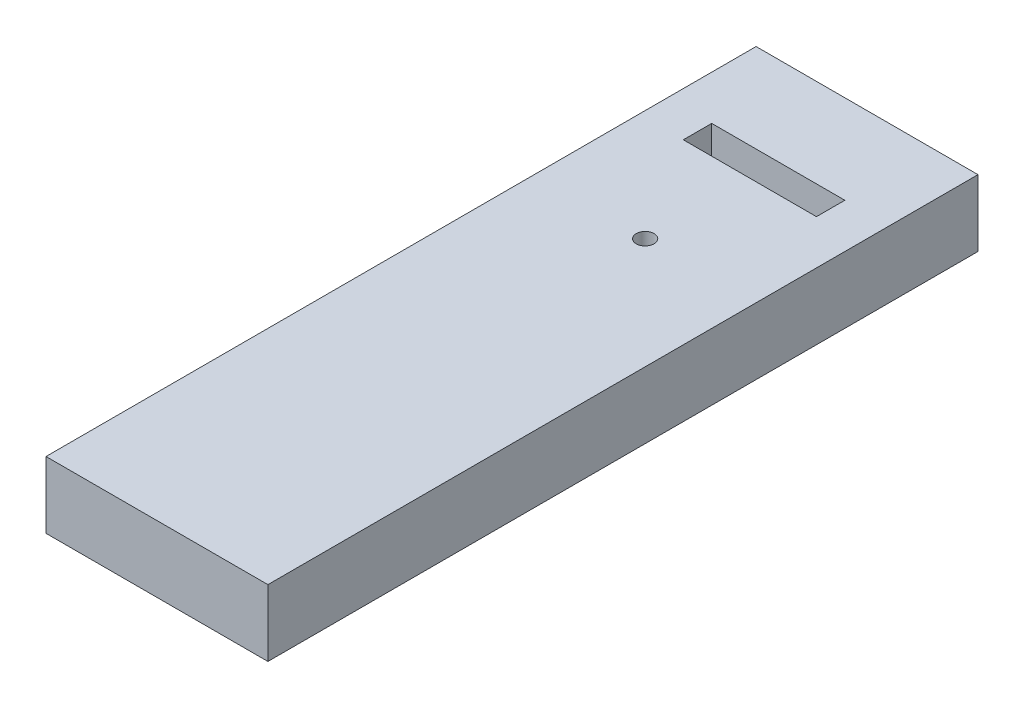
ISO-10303-21;
HEADER;
FILE_DESCRIPTION(('STEP AP214'),'2;1');
FILE_NAME('part.step','',(''),(''),'','','');
FILE_SCHEMA(('AUTOMOTIVE_DESIGN { 1 0 10303 214 1 1 1 1 }'));
ENDSEC;
DATA;
#1=APPLICATION_CONTEXT('core data for automotive mechanical design processes');
#2=APPLICATION_PROTOCOL_DEFINITION('international standard','automotive_design',2000,#1);
#3=PRODUCT_CONTEXT('',#1,'mechanical');
#4=PRODUCT('Part','Part','',(#3));
#5=PRODUCT_RELATED_PRODUCT_CATEGORY('part','',(#4));
#6=PRODUCT_DEFINITION_FORMATION('','',#4);
#7=PRODUCT_DEFINITION_CONTEXT('part definition',#1,'design');
#8=PRODUCT_DEFINITION('design','',#6,#7);
#9=PRODUCT_DEFINITION_SHAPE('','',#8);
#10=(LENGTH_UNIT() NAMED_UNIT(*) SI_UNIT(.MILLI.,.METRE.));
#11=(NAMED_UNIT(*) PLANE_ANGLE_UNIT() SI_UNIT($,.RADIAN.));
#12=(NAMED_UNIT(*) SI_UNIT($,.STERADIAN.) SOLID_ANGLE_UNIT());
#13=UNCERTAINTY_MEASURE_WITH_UNIT(LENGTH_MEASURE(1.E-05),#10,'distance_accuracy_value','');
#14=(GEOMETRIC_REPRESENTATION_CONTEXT(3) GLOBAL_UNCERTAINTY_ASSIGNED_CONTEXT((#13)) GLOBAL_UNIT_ASSIGNED_CONTEXT((#10,
#11,#12)) REPRESENTATION_CONTEXT('',''));
#15=CARTESIAN_POINT('',(0.,0.,0.));
#16=DIRECTION('',(0.,0.,1.));
#17=DIRECTION('',(1.,0.,0.));
#18=AXIS2_PLACEMENT_3D('',#15,#16,#17);
#19=CARTESIAN_POINT('',(0.,0.,0.));
#20=DIRECTION('',(0.,-1.,0.));
#21=DIRECTION('',(0.,0.,-1.));
#22=AXIS2_PLACEMENT_3D('',#19,#20,#21);
#23=PLANE('',#22);
#24=CARTESIAN_POINT('',(-23.8125,0.,-73.025));
#25=DIRECTION('',(0.,-1.,0.));
#26=DIRECTION('',(0.,0.,-1.));
#27=AXIS2_PLACEMENT_3D('',#24,#25,#26);
#28=CIRCLE('',#27,3.175);
#29=CARTESIAN_POINT('',(-26.9875,0.,-73.025));
#30=VERTEX_POINT('',#29);
#31=CARTESIAN_POINT('',(-23.8125,0.,-76.2));
#32=VERTEX_POINT('',#31);
#33=EDGE_CURVE('E339',#30,#32,#28,.T.);
#34=ORIENTED_EDGE('',*,*,#33,.F.);
#35=DIRECTION('',(0.,0.,-1.));
#36=VECTOR('',#35,1.);
#37=CARTESIAN_POINT('',(-26.9875,0.,90.4875));
#38=LINE('',#37,#36);
#39=CARTESIAN_POINT('',(-26.9875,0.,90.4875));
#40=VERTEX_POINT('',#39);
#41=EDGE_CURVE('E394',#40,#30,#38,.T.);
#42=ORIENTED_EDGE('',*,*,#41,.F.);
#43=CARTESIAN_POINT('',(-20.6375,0.,90.4875));
#44=DIRECTION('',(0.,-1.,0.));
#45=DIRECTION('',(0.,0.,-1.));
#46=AXIS2_PLACEMENT_3D('',#43,#44,#45);
#47=CIRCLE('',#46,6.35);
#48=CARTESIAN_POINT('',(-20.6375,0.,96.8375));
#49=VERTEX_POINT('',#48);
#50=EDGE_CURVE('E391',#49,#40,#47,.T.);
#51=ORIENTED_EDGE('',*,*,#50,.F.);
#52=DIRECTION('',(-1.,0.,0.));
#53=VECTOR('',#52,1.);
#54=CARTESIAN_POINT('',(20.6375,0.,96.8375));
#55=LINE('',#54,#53);
#56=CARTESIAN_POINT('',(20.6375,0.,96.8375));
#57=VERTEX_POINT('',#56);
#58=EDGE_CURVE('E388',#57,#49,#55,.T.);
#59=ORIENTED_EDGE('',*,*,#58,.F.);
#60=CARTESIAN_POINT('',(20.6375,0.,90.4875));
#61=DIRECTION('',(0.,-1.,0.));
#62=DIRECTION('',(0.,0.,-1.));
#63=AXIS2_PLACEMENT_3D('',#60,#61,#62);
#64=CIRCLE('',#63,6.35);
#65=CARTESIAN_POINT('',(26.9875,0.,90.4875));
#66=VERTEX_POINT('',#65);
#67=EDGE_CURVE('E350',#66,#57,#64,.T.);
#68=ORIENTED_EDGE('',*,*,#67,.F.);
#69=DIRECTION('',(0.,0.,1.));
#70=VECTOR('',#69,1.);
#71=CARTESIAN_POINT('',(26.9875,0.,90.4875));
#72=LINE('',#71,#70);
#73=CARTESIAN_POINT('',(26.9875,0.,-73.025));
#74=VERTEX_POINT('',#73);
#75=EDGE_CURVE('E370',#74,#66,#72,.T.);
#76=ORIENTED_EDGE('',*,*,#75,.F.);
#77=CARTESIAN_POINT('',(23.8125,0.,-73.025));
#78=DIRECTION('',(0.,-1.,0.));
#79=DIRECTION('',(0.,0.,-1.));
#80=AXIS2_PLACEMENT_3D('',#77,#78,#79);
#81=CIRCLE('',#80,3.175);
#82=CARTESIAN_POINT('',(23.8125,0.,-76.2));
#83=VERTEX_POINT('',#82);
#84=EDGE_CURVE('E320',#83,#74,#81,.T.);
#85=ORIENTED_EDGE('',*,*,#84,.F.);
#86=DIRECTION('',(1.,0.,0.));
#87=VECTOR('',#86,1.);
#88=CARTESIAN_POINT('',(23.8125,0.,-76.2));
#89=LINE('',#88,#87);
#90=CARTESIAN_POINT('',(4.76250000000001,0.,-76.2));
#91=VERTEX_POINT('',#90);
#92=EDGE_CURVE('E342',#91,#83,#89,.T.);
#93=ORIENTED_EDGE('',*,*,#92,.F.);
#94=DIRECTION('',(0.,0.,-1.));
#95=VECTOR('',#94,1.);
#96=CARTESIAN_POINT('',(4.76250000000001,0.,-76.2));
#97=LINE('',#96,#95);
#98=CARTESIAN_POINT('',(4.76250000000001,0.,-101.6));
#99=VERTEX_POINT('',#98);
#100=EDGE_CURVE('E284',#99,#91,#97,.F.);
#101=ORIENTED_EDGE('',*,*,#100,.F.);
#102=DIRECTION('',(-1.,0.,0.));
#103=VECTOR('',#102,1.);
#104=CARTESIAN_POINT('',(-31.75,0.,-101.6));
#105=LINE('',#104,#103);
#106=CARTESIAN_POINT('',(31.75,0.,-101.6));
#107=VERTEX_POINT('',#106);
#108=EDGE_CURVE('E267',#107,#99,#105,.T.);
#109=ORIENTED_EDGE('',*,*,#108,.F.);
#110=DIRECTION('',(0.,0.,-1.));
#111=VECTOR('',#110,1.);
#112=CARTESIAN_POINT('',(31.75,0.,101.6));
#113=LINE('',#112,#111);
#114=CARTESIAN_POINT('',(31.75,0.,101.6));
#115=VERTEX_POINT('',#114);
#116=EDGE_CURVE('E249',#115,#107,#113,.T.);
#117=ORIENTED_EDGE('',*,*,#116,.F.);
#118=DIRECTION('',(1.,0.,0.));
#119=VECTOR('',#118,1.);
#120=CARTESIAN_POINT('',(-31.75,0.,101.6));
#121=LINE('',#120,#119);
#122=CARTESIAN_POINT('',(-31.75,0.,101.6));
#123=VERTEX_POINT('',#122);
#124=EDGE_CURVE('E257',#123,#115,#121,.T.);
#125=ORIENTED_EDGE('',*,*,#124,.F.);
#126=DIRECTION('',(0.,0.,1.));
#127=VECTOR('',#126,1.);
#128=CARTESIAN_POINT('',(-31.75,0.,101.6));
#129=LINE('',#128,#127);
#130=CARTESIAN_POINT('',(-31.75,0.,-101.6));
#131=VERTEX_POINT('',#130);
#132=EDGE_CURVE('E270',#131,#123,#129,.T.);
#133=ORIENTED_EDGE('',*,*,#132,.F.);
#134=CARTESIAN_POINT('',(-4.76249999999999,0.,-101.6));
#135=VERTEX_POINT('',#134);
#136=EDGE_CURVE('E266',#135,#131,#105,.T.);
#137=ORIENTED_EDGE('',*,*,#136,.F.);
#138=DIRECTION('',(0.,0.,-1.));
#139=VECTOR('',#138,1.);
#140=CARTESIAN_POINT('',(-4.76249999999999,0.,-76.2));
#141=LINE('',#140,#139);
#142=CARTESIAN_POINT('',(-4.76249999999999,0.,-76.2));
#143=VERTEX_POINT('',#142);
#144=EDGE_CURVE('E287',#143,#135,#141,.T.);
#145=ORIENTED_EDGE('',*,*,#144,.F.);
#146=EDGE_CURVE('E343',#32,#143,#89,.T.);
#147=ORIENTED_EDGE('',*,*,#146,.F.);
#148=EDGE_LOOP('',(#34,#42,#51,#59,#68,#76,#85,#93,#101,#109,#117,#125,#133,#137,#145,#147));
#149=FACE_BOUND('',#148,.T.);
#150=ADVANCED_FACE('F35',(#149),#23,.T.);
#151=CARTESIAN_POINT('',(0.,19.05,0.));
#152=DIRECTION('',(0.,-1.,0.));
#153=DIRECTION('',(0.,0.,-1.));
#154=AXIS2_PLACEMENT_3D('',#151,#152,#153);
#155=PLANE('',#154);
#156=CARTESIAN_POINT('',(0.,19.05,-38.1));
#157=DIRECTION('',(0.,1.,0.));
#158=DIRECTION('',(0.,0.,1.));
#159=AXIS2_PLACEMENT_3D('',#156,#157,#158);
#160=CIRCLE('',#159,2.5527);
#161=CARTESIAN_POINT('',(0.,19.05,-35.5473));
#162=VERTEX_POINT('',#161);
#163=EDGE_CURVE('E487',#162,#162,#160,.T.);
#164=ORIENTED_EDGE('',*,*,#163,.F.);
#165=EDGE_LOOP('',(#164));
#166=FACE_BOUND('',#165,.T.);
#167=DIRECTION('',(0.,0.,-1.));
#168=VECTOR('',#167,1.);
#169=CARTESIAN_POINT('',(31.75,19.05,101.6));
#170=LINE('',#169,#168);
#171=CARTESIAN_POINT('',(31.75,19.05,101.6));
#172=VERTEX_POINT('',#171);
#173=CARTESIAN_POINT('',(31.75,19.05,-101.6));
#174=VERTEX_POINT('',#173);
#175=EDGE_CURVE('E253',#172,#174,#170,.T.);
#176=ORIENTED_EDGE('',*,*,#175,.T.);
#177=DIRECTION('',(-1.,0.,0.));
#178=VECTOR('',#177,1.);
#179=CARTESIAN_POINT('',(-31.75,19.05,-101.6));
#180=LINE('',#179,#178);
#181=CARTESIAN_POINT('',(-31.75,19.05,-101.6));
#182=VERTEX_POINT('',#181);
#183=EDGE_CURVE('E256',#174,#182,#180,.T.);
#184=ORIENTED_EDGE('',*,*,#183,.T.);
#185=DIRECTION('',(0.,0.,1.));
#186=VECTOR('',#185,1.);
#187=CARTESIAN_POINT('',(-31.75,19.05,101.6));
#188=LINE('',#187,#186);
#189=CARTESIAN_POINT('',(-31.75,19.05,101.6));
#190=VERTEX_POINT('',#189);
#191=EDGE_CURVE('E259',#182,#190,#188,.T.);
#192=ORIENTED_EDGE('',*,*,#191,.T.);
#193=DIRECTION('',(1.,0.,0.));
#194=VECTOR('',#193,1.);
#195=CARTESIAN_POINT('',(-31.75,19.05,101.6));
#196=LINE('',#195,#194);
#197=EDGE_CURVE('E261',#190,#172,#196,.T.);
#198=ORIENTED_EDGE('',*,*,#197,.T.);
#199=EDGE_LOOP('',(#176,#184,#192,#198));
#200=FACE_BOUND('',#199,.T.);
#201=DIRECTION('',(0.,0.,-1.));
#202=VECTOR('',#201,1.);
#203=CARTESIAN_POINT('',(19.05,19.05,-76.2));
#204=LINE('',#203,#202);
#205=CARTESIAN_POINT('',(19.05,19.05,-68.072));
#206=VERTEX_POINT('',#205);
#207=CARTESIAN_POINT('',(19.05,19.05,-76.2));
#208=VERTEX_POINT('',#207);
#209=EDGE_CURVE('E410',#206,#208,#204,.T.);
#210=ORIENTED_EDGE('',*,*,#209,.F.);
#211=DIRECTION('',(1.,0.,0.));
#212=VECTOR('',#211,1.);
#213=CARTESIAN_POINT('',(19.05,19.05,-68.072));
#214=LINE('',#213,#212);
#215=CARTESIAN_POINT('',(-19.05,19.05,-68.072));
#216=VERTEX_POINT('',#215);
#217=EDGE_CURVE('E419',#216,#206,#214,.T.);
#218=ORIENTED_EDGE('',*,*,#217,.F.);
#219=DIRECTION('',(0.,0.,1.));
#220=VECTOR('',#219,1.);
#221=CARTESIAN_POINT('',(-19.05,19.05,-76.2));
#222=LINE('',#221,#220);
#223=CARTESIAN_POINT('',(-19.05,19.05,-76.2));
#224=VERTEX_POINT('',#223);
#225=EDGE_CURVE('E417',#224,#216,#222,.T.);
#226=ORIENTED_EDGE('',*,*,#225,.F.);
#227=DIRECTION('',(-1.,0.,0.));
#228=VECTOR('',#227,1.);
#229=CARTESIAN_POINT('',(19.05,19.05,-76.2));
#230=LINE('',#229,#228);
#231=EDGE_CURVE('E415',#208,#224,#230,.T.);
#232=ORIENTED_EDGE('',*,*,#231,.F.);
#233=EDGE_LOOP('',(#210,#218,#226,#232));
#234=FACE_BOUND('',#233,.T.);
#235=ADVANCED_FACE('F430',(#166,#200,#234),#155,.F.);
#236=CARTESIAN_POINT('',(-23.8125,9.525,-73.025));
#237=DIRECTION('',(0.,-1.,0.));
#238=DIRECTION('',(0.,0.,-1.));
#239=AXIS2_PLACEMENT_3D('',#236,#237,#238);
#240=PLANE('',#239);
#241=DIRECTION('',(-1.,0.,0.));
#242=VECTOR('',#241,1.);
#243=CARTESIAN_POINT('',(-23.8125,9.525,-68.072));
#244=LINE('',#243,#242);
#245=CARTESIAN_POINT('',(23.8125,9.525,-68.072));
#246=VERTEX_POINT('',#245);
#247=CARTESIAN_POINT('',(19.05,9.525,-68.072));
#248=VERTEX_POINT('',#247);
#249=EDGE_CURVE('E303',#246,#248,#244,.T.);
#250=ORIENTED_EDGE('',*,*,#249,.T.);
#251=DIRECTION('',(0.,0.,-1.));
#252=VECTOR('',#251,1.);
#253=CARTESIAN_POINT('',(19.05,9.525,-73.0249999999999));
#254=LINE('',#253,#252);
#255=CARTESIAN_POINT('',(19.05,9.525,-76.2));
#256=VERTEX_POINT('',#255);
#257=EDGE_CURVE('E44',#248,#256,#254,.T.);
#258=ORIENTED_EDGE('',*,*,#257,.T.);
#259=DIRECTION('',(1.,0.,0.));
#260=VECTOR('',#259,1.);
#261=CARTESIAN_POINT('',(23.8125,9.525,-76.2));
#262=LINE('',#261,#260);
#263=CARTESIAN_POINT('',(23.8125,9.525,-76.2));
#264=VERTEX_POINT('',#263);
#265=EDGE_CURVE('E299',#256,#264,#262,.T.);
#266=ORIENTED_EDGE('',*,*,#265,.T.);
#267=CARTESIAN_POINT('',(23.8125,9.525,-73.025));
#268=DIRECTION('',(0.,-1.,0.));
#269=DIRECTION('',(0.,0.,-1.));
#270=AXIS2_PLACEMENT_3D('',#267,#268,#269);
#271=CIRCLE('',#270,3.175);
#272=CARTESIAN_POINT('',(26.9875,9.525,-73.025));
#273=VERTEX_POINT('',#272);
#274=EDGE_CURVE('E318',#264,#273,#271,.T.);
#275=ORIENTED_EDGE('',*,*,#274,.T.);
#276=DIRECTION('',(0.,0.,1.));
#277=VECTOR('',#276,1.);
#278=CARTESIAN_POINT('',(26.9875,9.525,-71.247));
#279=LINE('',#278,#277);
#280=CARTESIAN_POINT('',(26.9875,9.525,-71.247));
#281=VERTEX_POINT('',#280);
#282=EDGE_CURVE('E325',#273,#281,#279,.T.);
#283=ORIENTED_EDGE('',*,*,#282,.T.);
#284=CARTESIAN_POINT('',(23.8125,9.525,-71.247));
#285=DIRECTION('',(0.,-1.,0.));
#286=DIRECTION('',(0.,0.,1.));
#287=AXIS2_PLACEMENT_3D('',#284,#285,#286);
#288=CIRCLE('',#287,3.17499999999999);
#289=EDGE_CURVE('E328',#281,#246,#288,.T.);
#290=ORIENTED_EDGE('',*,*,#289,.T.);
#291=EDGE_LOOP('',(#250,#258,#266,#275,#283,#290));
#292=FACE_BOUND('',#291,.T.);
#293=ADVANCED_FACE('F297',(#292),#240,.T.);
#294=CARTESIAN_POINT('',(-23.8125,9.525,-76.2));
#295=VERTEX_POINT('',#294);
#296=CARTESIAN_POINT('',(-19.05,9.525,-76.2));
#297=VERTEX_POINT('',#296);
#298=EDGE_CURVE('E314',#295,#297,#262,.T.);
#299=ORIENTED_EDGE('',*,*,#298,.T.);
#300=DIRECTION('',(0.,0.,1.));
#301=VECTOR('',#300,1.);
#302=CARTESIAN_POINT('',(-19.05,9.525,-73.025));
#303=LINE('',#302,#301);
#304=CARTESIAN_POINT('',(-19.05,9.525,-68.072));
#305=VERTEX_POINT('',#304);
#306=EDGE_CURVE('E289',#297,#305,#303,.T.);
#307=ORIENTED_EDGE('',*,*,#306,.T.);
#308=CARTESIAN_POINT('',(-23.8125,9.525,-68.072));
#309=VERTEX_POINT('',#308);
#310=EDGE_CURVE('E330',#305,#309,#244,.T.);
#311=ORIENTED_EDGE('',*,*,#310,.T.);
#312=CARTESIAN_POINT('',(-23.8125,9.525,-71.247));
#313=DIRECTION('',(0.,-1.,0.));
#314=DIRECTION('',(0.,0.,-1.));
#315=AXIS2_PLACEMENT_3D('',#312,#313,#314);
#316=CIRCLE('',#315,3.175);
#317=CARTESIAN_POINT('',(-26.9875,9.525,-71.247));
#318=VERTEX_POINT('',#317);
#319=EDGE_CURVE('E332',#309,#318,#316,.T.);
#320=ORIENTED_EDGE('',*,*,#319,.T.);
#321=DIRECTION('',(0.,0.,-1.));
#322=VECTOR('',#321,1.);
#323=CARTESIAN_POINT('',(-26.9875,9.525,-71.247));
#324=LINE('',#323,#322);
#325=CARTESIAN_POINT('',(-26.9875,9.525,-73.025));
#326=VERTEX_POINT('',#325);
#327=EDGE_CURVE('E335',#318,#326,#324,.T.);
#328=ORIENTED_EDGE('',*,*,#327,.T.);
#329=CARTESIAN_POINT('',(-23.8125,9.525,-73.025));
#330=DIRECTION('',(0.,-1.,0.));
#331=DIRECTION('',(0.,0.,-1.));
#332=AXIS2_PLACEMENT_3D('',#329,#330,#331);
#333=CIRCLE('',#332,3.175);
#334=EDGE_CURVE('E315',#326,#295,#333,.T.);
#335=ORIENTED_EDGE('',*,*,#334,.T.);
#336=EDGE_LOOP('',(#299,#307,#311,#320,#328,#335));
#337=FACE_BOUND('',#336,.T.);
#338=ADVANCED_FACE('F437',(#337),#240,.T.);
#339=CARTESIAN_POINT('',(31.75,19.05,101.6));
#340=DIRECTION('',(-1.,0.,0.));
#341=DIRECTION('',(0.,0.,1.));
#342=AXIS2_PLACEMENT_3D('',#339,#340,#341);
#343=PLANE('',#342);
#344=ORIENTED_EDGE('',*,*,#116,.T.);
#345=DIRECTION('',(0.,-1.,0.));
#346=VECTOR('',#345,1.);
#347=CARTESIAN_POINT('',(31.75,19.05,-101.6));
#348=LINE('',#347,#346);
#349=EDGE_CURVE('E281',#174,#107,#348,.T.);
#350=ORIENTED_EDGE('',*,*,#349,.F.);
#351=ORIENTED_EDGE('',*,*,#175,.F.);
#352=DIRECTION('',(0.,-1.,0.));
#353=VECTOR('',#352,1.);
#354=CARTESIAN_POINT('',(31.75,19.05,101.6));
#355=LINE('',#354,#353);
#356=EDGE_CURVE('E263',#172,#115,#355,.T.);
#357=ORIENTED_EDGE('',*,*,#356,.T.);
#358=EDGE_LOOP('',(#344,#350,#351,#357));
#359=FACE_BOUND('',#358,.T.);
#360=ADVANCED_FACE('F37',(#359),#343,.F.);
#361=CARTESIAN_POINT('',(-31.75,19.05,-101.6));
#362=DIRECTION('',(0.,0.,1.));
#363=DIRECTION('',(1.,0.,0.));
#364=AXIS2_PLACEMENT_3D('',#361,#362,#363);
#365=PLANE('',#364);
#366=ORIENTED_EDGE('',*,*,#108,.T.);
#367=CARTESIAN_POINT('',(0.,0.,-101.6));
#368=DIRECTION('',(0.,0.,-1.));
#369=DIRECTION('',(-1.,0.,0.));
#370=AXIS2_PLACEMENT_3D('',#367,#368,#369);
#371=CIRCLE('',#370,4.7625);
#372=EDGE_CURVE('E250',#135,#99,#371,.T.);
#373=ORIENTED_EDGE('',*,*,#372,.F.);
#374=ORIENTED_EDGE('',*,*,#136,.T.);
#375=DIRECTION('',(0.,-1.,0.));
#376=VECTOR('',#375,1.);
#377=CARTESIAN_POINT('',(-31.75,19.05,-101.6));
#378=LINE('',#377,#376);
#379=EDGE_CURVE('E278',#182,#131,#378,.T.);
#380=ORIENTED_EDGE('',*,*,#379,.F.);
#381=ORIENTED_EDGE('',*,*,#183,.F.);
#382=ORIENTED_EDGE('',*,*,#349,.T.);
#383=EDGE_LOOP('',(#366,#373,#374,#380,#381,#382));
#384=FACE_BOUND('',#383,.T.);
#385=ADVANCED_FACE('F464',(#384),#365,.F.);
#386=CARTESIAN_POINT('',(-31.75,19.05,101.6));
#387=DIRECTION('',(1.,0.,0.));
#388=DIRECTION('',(0.,0.,-1.));
#389=AXIS2_PLACEMENT_3D('',#386,#387,#388);
#390=PLANE('',#389);
#391=ORIENTED_EDGE('',*,*,#132,.T.);
#392=DIRECTION('',(0.,-1.,0.));
#393=VECTOR('',#392,1.);
#394=CARTESIAN_POINT('',(-31.75,19.05,101.6));
#395=LINE('',#394,#393);
#396=EDGE_CURVE('E275',#190,#123,#395,.T.);
#397=ORIENTED_EDGE('',*,*,#396,.F.);
#398=ORIENTED_EDGE('',*,*,#191,.F.);
#399=ORIENTED_EDGE('',*,*,#379,.T.);
#400=EDGE_LOOP('',(#391,#397,#398,#399));
#401=FACE_BOUND('',#400,.T.);
#402=ADVANCED_FACE('F467',(#401),#390,.F.);
#403=CARTESIAN_POINT('',(-31.75,19.05,101.6));
#404=DIRECTION('',(0.,0.,-1.));
#405=DIRECTION('',(-1.,0.,0.));
#406=AXIS2_PLACEMENT_3D('',#403,#404,#405);
#407=PLANE('',#406);
#408=ORIENTED_EDGE('',*,*,#124,.T.);
#409=ORIENTED_EDGE('',*,*,#356,.F.);
#410=ORIENTED_EDGE('',*,*,#197,.F.);
#411=ORIENTED_EDGE('',*,*,#396,.T.);
#412=EDGE_LOOP('',(#408,#409,#410,#411));
#413=FACE_BOUND('',#412,.T.);
#414=ADVANCED_FACE('F530',(#413),#407,.F.);
#415=CARTESIAN_POINT('',(0.,0.,-76.2));
#416=DIRECTION('',(0.,0.,-1.));
#417=DIRECTION('',(-1.,0.,0.));
#418=AXIS2_PLACEMENT_3D('',#415,#416,#417);
#419=CYLINDRICAL_SURFACE('',#418,4.7625);
#420=ORIENTED_EDGE('',*,*,#144,.T.);
#421=ORIENTED_EDGE('',*,*,#372,.T.);
#422=ORIENTED_EDGE('',*,*,#100,.T.);
#423=CARTESIAN_POINT('',(0.,0.,-76.2));
#424=DIRECTION('',(0.,0.,-1.));
#425=DIRECTION('',(-1.,0.,0.));
#426=AXIS2_PLACEMENT_3D('',#423,#424,#425);
#427=CIRCLE('',#426,4.7625);
#428=EDGE_CURVE('E247',#143,#91,#427,.T.);
#429=ORIENTED_EDGE('',*,*,#428,.F.);
#430=EDGE_LOOP('',(#420,#421,#422,#429));
#431=FACE_BOUND('',#430,.T.);
#432=ADVANCED_FACE('F456',(#431),#419,.F.);
#433=CARTESIAN_POINT('',(20.6375,9.525,90.4875));
#434=DIRECTION('',(0.,-1.,0.));
#435=DIRECTION('',(0.,0.,-1.));
#436=AXIS2_PLACEMENT_3D('',#433,#434,#435);
#437=CYLINDRICAL_SURFACE('',#436,6.35);
#438=ORIENTED_EDGE('',*,*,#67,.T.);
#439=DIRECTION('',(0.,-1.,0.));
#440=VECTOR('',#439,1.);
#441=CARTESIAN_POINT('',(20.6375,9.525,96.8375));
#442=LINE('',#441,#440);
#443=CARTESIAN_POINT('',(20.6375,9.525,96.8375));
#444=VERTEX_POINT('',#443);
#445=EDGE_CURVE('E243',#444,#57,#442,.T.);
#446=ORIENTED_EDGE('',*,*,#445,.F.);
#447=CARTESIAN_POINT('',(20.6375,9.525,90.4875));
#448=DIRECTION('',(0.,-1.,0.));
#449=DIRECTION('',(0.,0.,-1.));
#450=AXIS2_PLACEMENT_3D('',#447,#448,#449);
#451=CIRCLE('',#450,6.35);
#452=CARTESIAN_POINT('',(26.9875,9.525,90.4875));
#453=VERTEX_POINT('',#452);
#454=EDGE_CURVE('E366',#453,#444,#451,.T.);
#455=ORIENTED_EDGE('',*,*,#454,.F.);
#456=DIRECTION('',(0.,-1.,0.));
#457=VECTOR('',#456,1.);
#458=CARTESIAN_POINT('',(26.9875,9.525,90.4875));
#459=LINE('',#458,#457);
#460=EDGE_CURVE('E252',#453,#66,#459,.T.);
#461=ORIENTED_EDGE('',*,*,#460,.T.);
#462=EDGE_LOOP('',(#438,#446,#455,#461));
#463=FACE_BOUND('',#462,.T.);
#464=ADVANCED_FACE('F505',(#463),#437,.F.);
#465=CARTESIAN_POINT('',(26.9875,9.525,90.4875));
#466=DIRECTION('',(1.,0.,0.));
#467=DIRECTION('',(0.,0.,-1.));
#468=AXIS2_PLACEMENT_3D('',#465,#466,#467);
#469=PLANE('',#468);
#470=ORIENTED_EDGE('',*,*,#75,.T.);
#471=ORIENTED_EDGE('',*,*,#460,.F.);
#472=DIRECTION('',(0.,0.,1.));
#473=VECTOR('',#472,1.);
#474=CARTESIAN_POINT('',(26.9875,9.525,90.4875));
#475=LINE('',#474,#473);
#476=CARTESIAN_POINT('',(26.9875,9.525,-41.402));
#477=VERTEX_POINT('',#476);
#478=EDGE_CURVE('E246',#477,#453,#475,.T.);
#479=ORIENTED_EDGE('',*,*,#478,.F.);
#480=DIRECTION('',(0.,-1.,0.));
#481=VECTOR('',#480,1.);
#482=CARTESIAN_POINT('',(26.9875,9.525,-41.402));
#483=LINE('',#482,#481);
#484=CARTESIAN_POINT('',(26.9875,2.159,-41.402));
#485=VERTEX_POINT('',#484);
#486=EDGE_CURVE('E399',#477,#485,#483,.T.);
#487=ORIENTED_EDGE('',*,*,#486,.T.);
#488=DIRECTION('',(0.,0.,-1.));
#489=VECTOR('',#488,1.);
#490=CARTESIAN_POINT('',(26.9875,2.159,-71.247));
#491=LINE('',#490,#489);
#492=CARTESIAN_POINT('',(26.9875,2.159,-71.247));
#493=VERTEX_POINT('',#492);
#494=EDGE_CURVE('E51',#485,#493,#491,.T.);
#495=ORIENTED_EDGE('',*,*,#494,.T.);
#496=DIRECTION('',(0.,-1.,0.));
#497=VECTOR('',#496,1.);
#498=CARTESIAN_POINT('',(26.9875,9.525,-71.247));
#499=LINE('',#498,#497);
#500=EDGE_CURVE('E358',#281,#493,#499,.T.);
#501=ORIENTED_EDGE('',*,*,#500,.F.);
#502=ORIENTED_EDGE('',*,*,#282,.F.);
#503=DIRECTION('',(0.,-1.,0.));
#504=VECTOR('',#503,1.);
#505=CARTESIAN_POINT('',(26.9875,9.525,-73.025));
#506=LINE('',#505,#504);
#507=EDGE_CURVE('E361',#273,#74,#506,.T.);
#508=ORIENTED_EDGE('',*,*,#507,.T.);
#509=EDGE_LOOP('',(#470,#471,#479,#487,#495,#501,#502,#508));
#510=FACE_BOUND('',#509,.T.);
#511=ADVANCED_FACE('F481',(#510),#469,.F.);
#512=CARTESIAN_POINT('',(20.6375,9.525,-41.402));
#513=DIRECTION('',(0.,-1.,0.));
#514=DIRECTION('',(0.,0.,-1.));
#515=AXIS2_PLACEMENT_3D('',#512,#513,#514);
#516=CYLINDRICAL_SURFACE('',#515,6.35);
#517=DIRECTION('',(0.,-1.,0.));
#518=VECTOR('',#517,1.);
#519=CARTESIAN_POINT('',(20.6375,9.525,-47.752));
#520=LINE('',#519,#518);
#521=CARTESIAN_POINT('',(20.6375,9.525,-47.752));
#522=VERTEX_POINT('',#521);
#523=CARTESIAN_POINT('',(20.6375,2.159,-47.752));
#524=VERTEX_POINT('',#523);
#525=EDGE_CURVE('E236',#522,#524,#520,.T.);
#526=ORIENTED_EDGE('',*,*,#525,.T.);
#527=CARTESIAN_POINT('',(20.6375,2.159,-41.402));
#528=DIRECTION('',(0.,1.,0.));
#529=DIRECTION('',(0.,0.,1.));
#530=AXIS2_PLACEMENT_3D('',#527,#528,#529);
#531=CIRCLE('',#530,6.35);
#532=EDGE_CURVE('E405',#524,#485,#531,.F.);
#533=ORIENTED_EDGE('',*,*,#532,.T.);
#534=ORIENTED_EDGE('',*,*,#486,.F.);
#535=CARTESIAN_POINT('',(20.6375,9.525,-41.402));
#536=DIRECTION('',(0.,-1.,0.));
#537=DIRECTION('',(0.,0.,-1.));
#538=AXIS2_PLACEMENT_3D('',#535,#536,#537);
#539=CIRCLE('',#538,6.35);
#540=EDGE_CURVE('E382',#522,#477,#539,.T.);
#541=ORIENTED_EDGE('',*,*,#540,.F.);
#542=EDGE_LOOP('',(#526,#533,#534,#541));
#543=FACE_BOUND('',#542,.T.);
#544=ADVANCED_FACE('F404',(#543),#516,.F.);
#545=CARTESIAN_POINT('',(-20.6375,9.525,-47.752));
#546=DIRECTION('',(0.,0.,-1.));
#547=DIRECTION('',(-1.,0.,0.));
#548=AXIS2_PLACEMENT_3D('',#545,#546,#547);
#549=PLANE('',#548);
#550=DIRECTION('',(0.,-1.,0.));
#551=VECTOR('',#550,1.);
#552=CARTESIAN_POINT('',(-20.6375,9.525,-47.752));
#553=LINE('',#552,#551);
#554=CARTESIAN_POINT('',(-20.6375,9.525,-47.752));
#555=VERTEX_POINT('',#554);
#556=CARTESIAN_POINT('',(-20.6375,2.159,-47.752));
#557=VERTEX_POINT('',#556);
#558=EDGE_CURVE('E233',#555,#557,#553,.T.);
#559=ORIENTED_EDGE('',*,*,#558,.T.);
#560=DIRECTION('',(1.,0.,0.));
#561=VECTOR('',#560,1.);
#562=CARTESIAN_POINT('',(-20.6375,2.159,-47.752));
#563=LINE('',#562,#561);
#564=EDGE_CURVE('E214',#557,#524,#563,.T.);
#565=ORIENTED_EDGE('',*,*,#564,.T.);
#566=ORIENTED_EDGE('',*,*,#525,.F.);
#567=DIRECTION('',(1.,0.,0.));
#568=VECTOR('',#567,1.);
#569=CARTESIAN_POINT('',(-20.6375,9.525,-47.752));
#570=LINE('',#569,#568);
#571=EDGE_CURVE('E379',#555,#522,#570,.T.);
#572=ORIENTED_EDGE('',*,*,#571,.F.);
#573=EDGE_LOOP('',(#559,#565,#566,#572));
#574=FACE_BOUND('',#573,.T.);
#575=ADVANCED_FACE('F408',(#574),#549,.F.);
#576=CARTESIAN_POINT('',(-20.6375,9.525,-41.402));
#577=DIRECTION('',(0.,-1.,0.));
#578=DIRECTION('',(0.,0.,-1.));
#579=AXIS2_PLACEMENT_3D('',#576,#577,#578);
#580=CYLINDRICAL_SURFACE('',#579,6.35);
#581=DIRECTION('',(0.,-1.,0.));
#582=VECTOR('',#581,1.);
#583=CARTESIAN_POINT('',(-26.9875,9.525,-41.402));
#584=LINE('',#583,#582);
#585=CARTESIAN_POINT('',(-26.9875,9.525,-41.402));
#586=VERTEX_POINT('',#585);
#587=CARTESIAN_POINT('',(-26.9875,2.159,-41.402));
#588=VERTEX_POINT('',#587);
#589=EDGE_CURVE('E224',#586,#588,#584,.T.);
#590=ORIENTED_EDGE('',*,*,#589,.T.);
#591=CARTESIAN_POINT('',(-20.6375,2.159,-41.402));
#592=DIRECTION('',(0.,1.,0.));
#593=DIRECTION('',(0.,0.,1.));
#594=AXIS2_PLACEMENT_3D('',#591,#592,#593);
#595=CIRCLE('',#594,6.35);
#596=EDGE_CURVE('E208',#588,#557,#595,.F.);
#597=ORIENTED_EDGE('',*,*,#596,.T.);
#598=ORIENTED_EDGE('',*,*,#558,.F.);
#599=CARTESIAN_POINT('',(-20.6375,9.525,-41.402));
#600=DIRECTION('',(0.,-1.,0.));
#601=DIRECTION('',(0.,0.,1.));
#602=AXIS2_PLACEMENT_3D('',#599,#600,#601);
#603=CIRCLE('',#602,6.35);
#604=EDGE_CURVE('E231',#586,#555,#603,.T.);
#605=ORIENTED_EDGE('',*,*,#604,.F.);
#606=EDGE_LOOP('',(#590,#597,#598,#605));
#607=FACE_BOUND('',#606,.T.);
#608=ADVANCED_FACE('F229',(#607),#580,.F.);
#609=CARTESIAN_POINT('',(-26.9875,9.525,90.4875));
#610=DIRECTION('',(-1.,0.,0.));
#611=DIRECTION('',(0.,0.,1.));
#612=AXIS2_PLACEMENT_3D('',#609,#610,#611);
#613=PLANE('',#612);
#614=ORIENTED_EDGE('',*,*,#41,.T.);
#615=DIRECTION('',(0.,-1.,0.));
#616=VECTOR('',#615,1.);
#617=CARTESIAN_POINT('',(-26.9875,9.525,-73.025));
#618=LINE('',#617,#616);
#619=EDGE_CURVE('E347',#326,#30,#618,.T.);
#620=ORIENTED_EDGE('',*,*,#619,.F.);
#621=ORIENTED_EDGE('',*,*,#327,.F.);
#622=DIRECTION('',(0.,-1.,0.));
#623=VECTOR('',#622,1.);
#624=CARTESIAN_POINT('',(-26.9875,9.525,-71.247));
#625=LINE('',#624,#623);
#626=CARTESIAN_POINT('',(-26.9875,2.159,-71.247));
#627=VERTEX_POINT('',#626);
#628=EDGE_CURVE('E227',#318,#627,#625,.T.);
#629=ORIENTED_EDGE('',*,*,#628,.T.);
#630=DIRECTION('',(0.,0.,1.));
#631=VECTOR('',#630,1.);
#632=CARTESIAN_POINT('',(-26.9875,2.159,-71.247));
#633=LINE('',#632,#631);
#634=EDGE_CURVE('E211',#627,#588,#633,.T.);
#635=ORIENTED_EDGE('',*,*,#634,.T.);
#636=ORIENTED_EDGE('',*,*,#589,.F.);
#637=DIRECTION('',(0.,0.,-1.));
#638=VECTOR('',#637,1.);
#639=CARTESIAN_POINT('',(-26.9875,9.525,90.4875));
#640=LINE('',#639,#638);
#641=CARTESIAN_POINT('',(-26.9875,9.525,90.4875));
#642=VERTEX_POINT('',#641);
#643=EDGE_CURVE('E376',#642,#586,#640,.T.);
#644=ORIENTED_EDGE('',*,*,#643,.F.);
#645=DIRECTION('',(0.,-1.,0.));
#646=VECTOR('',#645,1.);
#647=CARTESIAN_POINT('',(-26.9875,9.525,90.4875));
#648=LINE('',#647,#646);
#649=EDGE_CURVE('E234',#642,#40,#648,.T.);
#650=ORIENTED_EDGE('',*,*,#649,.T.);
#651=EDGE_LOOP('',(#614,#620,#621,#629,#635,#636,#644,#650));
#652=FACE_BOUND('',#651,.T.);
#653=ADVANCED_FACE('F222',(#652),#613,.F.);
#654=CARTESIAN_POINT('',(-20.6375,9.525,90.4875));
#655=DIRECTION('',(0.,-1.,0.));
#656=DIRECTION('',(0.,0.,-1.));
#657=AXIS2_PLACEMENT_3D('',#654,#655,#656);
#658=CYLINDRICAL_SURFACE('',#657,6.35);
#659=ORIENTED_EDGE('',*,*,#50,.T.);
#660=ORIENTED_EDGE('',*,*,#649,.F.);
#661=CARTESIAN_POINT('',(-20.6375,9.525,90.4875));
#662=DIRECTION('',(0.,-1.,0.));
#663=DIRECTION('',(0.,0.,-1.));
#664=AXIS2_PLACEMENT_3D('',#661,#662,#663);
#665=CIRCLE('',#664,6.35);
#666=CARTESIAN_POINT('',(-20.6375,9.525,96.8375));
#667=VERTEX_POINT('',#666);
#668=EDGE_CURVE('E373',#667,#642,#665,.T.);
#669=ORIENTED_EDGE('',*,*,#668,.F.);
#670=DIRECTION('',(0.,-1.,0.));
#671=VECTOR('',#670,1.);
#672=CARTESIAN_POINT('',(-20.6375,9.525,96.8375));
#673=LINE('',#672,#671);
#674=EDGE_CURVE('E238',#667,#49,#673,.T.);
#675=ORIENTED_EDGE('',*,*,#674,.T.);
#676=EDGE_LOOP('',(#659,#660,#669,#675));
#677=FACE_BOUND('',#676,.T.);
#678=ADVANCED_FACE('F512',(#677),#658,.F.);
#679=CARTESIAN_POINT('',(20.6375,9.525,96.8375));
#680=DIRECTION('',(0.,0.,1.));
#681=DIRECTION('',(1.,0.,0.));
#682=AXIS2_PLACEMENT_3D('',#679,#680,#681);
#683=PLANE('',#682);
#684=ORIENTED_EDGE('',*,*,#58,.T.);
#685=ORIENTED_EDGE('',*,*,#674,.F.);
#686=DIRECTION('',(-1.,0.,0.));
#687=VECTOR('',#686,1.);
#688=CARTESIAN_POINT('',(20.6375,9.525,96.8375));
#689=LINE('',#688,#687);
#690=EDGE_CURVE('E369',#444,#667,#689,.T.);
#691=ORIENTED_EDGE('',*,*,#690,.F.);
#692=ORIENTED_EDGE('',*,*,#445,.T.);
#693=EDGE_LOOP('',(#684,#685,#691,#692));
#694=FACE_BOUND('',#693,.T.);
#695=ADVANCED_FACE('F499',(#694),#683,.F.);
#696=CARTESIAN_POINT('',(20.6375,9.525,90.4875));
#697=DIRECTION('',(0.,-1.,0.));
#698=DIRECTION('',(0.,0.,-1.));
#699=AXIS2_PLACEMENT_3D('',#696,#697,#698);
#700=PLANE('',#699);
#701=CARTESIAN_POINT('',(0.,9.525,-38.1));
#702=DIRECTION('',(0.,-1.,0.));
#703=DIRECTION('',(0.,0.,-1.));
#704=AXIS2_PLACEMENT_3D('',#701,#702,#703);
#705=CIRCLE('',#704,2.5527);
#706=CARTESIAN_POINT('',(0.,9.525,-40.6527));
#707=VERTEX_POINT('',#706);
#708=EDGE_CURVE('E39',#707,#707,#705,.T.);
#709=ORIENTED_EDGE('',*,*,#708,.F.);
#710=EDGE_LOOP('',(#709));
#711=FACE_BOUND('',#710,.T.);
#712=ORIENTED_EDGE('',*,*,#454,.T.);
#713=ORIENTED_EDGE('',*,*,#690,.T.);
#714=ORIENTED_EDGE('',*,*,#668,.T.);
#715=ORIENTED_EDGE('',*,*,#643,.T.);
#716=ORIENTED_EDGE('',*,*,#604,.T.);
#717=ORIENTED_EDGE('',*,*,#571,.T.);
#718=ORIENTED_EDGE('',*,*,#540,.T.);
#719=ORIENTED_EDGE('',*,*,#478,.T.);
#720=EDGE_LOOP('',(#712,#713,#714,#715,#716,#717,#718,#719));
#721=FACE_BOUND('',#720,.T.);
#722=ADVANCED_FACE('F496',(#711,#721),#700,.T.);
#723=CARTESIAN_POINT('',(23.8125,9.525,-76.2));
#724=DIRECTION('',(0.,0.,-1.));
#725=DIRECTION('',(-1.,0.,0.));
#726=AXIS2_PLACEMENT_3D('',#723,#724,#725);
#727=PLANE('',#726);
#728=ORIENTED_EDGE('',*,*,#92,.T.);
#729=DIRECTION('',(0.,-1.,0.));
#730=VECTOR('',#729,1.);
#731=CARTESIAN_POINT('',(23.8125,9.525,-76.2));
#732=LINE('',#731,#730);
#733=EDGE_CURVE('E312',#264,#83,#732,.T.);
#734=ORIENTED_EDGE('',*,*,#733,.F.);
#735=ORIENTED_EDGE('',*,*,#265,.F.);
#736=DIRECTION('',(0.,-1.,0.));
#737=VECTOR('',#736,1.);
#738=CARTESIAN_POINT('',(19.05,19.05,-76.2));
#739=LINE('',#738,#737);
#740=EDGE_CURVE('E309',#208,#256,#739,.T.);
#741=ORIENTED_EDGE('',*,*,#740,.F.);
#742=ORIENTED_EDGE('',*,*,#231,.T.);
#743=DIRECTION('',(0.,-1.,0.));
#744=VECTOR('',#743,1.);
#745=CARTESIAN_POINT('',(-19.05,19.05,-76.2));
#746=LINE('',#745,#744);
#747=EDGE_CURVE('E424',#224,#297,#746,.T.);
#748=ORIENTED_EDGE('',*,*,#747,.T.);
#749=ORIENTED_EDGE('',*,*,#298,.F.);
#750=DIRECTION('',(0.,-1.,0.));
#751=VECTOR('',#750,1.);
#752=CARTESIAN_POINT('',(-23.8125,9.525,-76.2));
#753=LINE('',#752,#751);
#754=EDGE_CURVE('E338',#295,#32,#753,.T.);
#755=ORIENTED_EDGE('',*,*,#754,.T.);
#756=ORIENTED_EDGE('',*,*,#146,.T.);
#757=ORIENTED_EDGE('',*,*,#428,.T.);
#758=EDGE_LOOP('',(#728,#734,#735,#741,#742,#748,#749,#755,#756,#757));
#759=FACE_BOUND('',#758,.T.);
#760=ADVANCED_FACE('F308',(#759),#727,.F.);
#761=CARTESIAN_POINT('',(-23.8125,9.525,-73.025));
#762=DIRECTION('',(0.,-1.,0.));
#763=DIRECTION('',(0.,0.,-1.));
#764=AXIS2_PLACEMENT_3D('',#761,#762,#763);
#765=CYLINDRICAL_SURFACE('',#764,3.175);
#766=ORIENTED_EDGE('',*,*,#33,.T.);
#767=ORIENTED_EDGE('',*,*,#754,.F.);
#768=ORIENTED_EDGE('',*,*,#334,.F.);
#769=ORIENTED_EDGE('',*,*,#619,.T.);
#770=EDGE_LOOP('',(#766,#767,#768,#769));
#771=FACE_BOUND('',#770,.T.);
#772=ADVANCED_FACE('F449',(#771),#765,.F.);
#773=CARTESIAN_POINT('',(-23.8125,9.525,-71.247));
#774=DIRECTION('',(0.,-1.,0.));
#775=DIRECTION('',(0.,0.,-1.));
#776=AXIS2_PLACEMENT_3D('',#773,#774,#775);
#777=CYLINDRICAL_SURFACE('',#776,3.175);
#778=DIRECTION('',(0.,-1.,0.));
#779=VECTOR('',#778,1.);
#780=CARTESIAN_POINT('',(-23.8125,9.525,-68.072));
#781=LINE('',#780,#779);
#782=CARTESIAN_POINT('',(-23.8125,2.159,-68.072));
#783=VERTEX_POINT('',#782);
#784=EDGE_CURVE('E352',#309,#783,#781,.T.);
#785=ORIENTED_EDGE('',*,*,#784,.T.);
#786=CARTESIAN_POINT('',(-23.8125,2.159,-71.247));
#787=DIRECTION('',(0.,1.,0.));
#788=DIRECTION('',(0.,0.,1.));
#789=AXIS2_PLACEMENT_3D('',#786,#787,#788);
#790=CIRCLE('',#789,3.175);
#791=EDGE_CURVE('E218',#783,#627,#790,.F.);
#792=ORIENTED_EDGE('',*,*,#791,.T.);
#793=ORIENTED_EDGE('',*,*,#628,.F.);
#794=ORIENTED_EDGE('',*,*,#319,.F.);
#795=EDGE_LOOP('',(#785,#792,#793,#794));
#796=FACE_BOUND('',#795,.T.);
#797=ADVANCED_FACE('F444',(#796),#777,.F.);
#798=CARTESIAN_POINT('',(-23.8125,9.525,-68.072));
#799=DIRECTION('',(0.,0.,1.));
#800=DIRECTION('',(1.,0.,0.));
#801=AXIS2_PLACEMENT_3D('',#798,#799,#800);
#802=PLANE('',#801);
#803=DIRECTION('',(0.,-1.,0.));
#804=VECTOR('',#803,1.);
#805=CARTESIAN_POINT('',(23.8125,9.525,-68.072));
#806=LINE('',#805,#804);
#807=CARTESIAN_POINT('',(23.8125,2.159,-68.072));
#808=VERTEX_POINT('',#807);
#809=EDGE_CURVE('E355',#246,#808,#806,.T.);
#810=ORIENTED_EDGE('',*,*,#809,.T.);
#811=DIRECTION('',(-1.,0.,0.));
#812=VECTOR('',#811,1.);
#813=CARTESIAN_POINT('',(-23.8125,2.159,-68.072));
#814=LINE('',#813,#812);
#815=EDGE_CURVE('E442',#808,#783,#814,.T.);
#816=ORIENTED_EDGE('',*,*,#815,.T.);
#817=ORIENTED_EDGE('',*,*,#784,.F.);
#818=ORIENTED_EDGE('',*,*,#310,.F.);
#819=DIRECTION('',(0.,-1.,0.));
#820=VECTOR('',#819,1.);
#821=CARTESIAN_POINT('',(-19.05,19.05,-68.072));
#822=LINE('',#821,#820);
#823=EDGE_CURVE('E59',#216,#305,#822,.T.);
#824=ORIENTED_EDGE('',*,*,#823,.F.);
#825=ORIENTED_EDGE('',*,*,#217,.T.);
#826=DIRECTION('',(0.,-1.,0.));
#827=VECTOR('',#826,1.);
#828=CARTESIAN_POINT('',(19.05,19.05,-68.072));
#829=LINE('',#828,#827);
#830=EDGE_CURVE('E421',#206,#248,#829,.T.);
#831=ORIENTED_EDGE('',*,*,#830,.T.);
#832=ORIENTED_EDGE('',*,*,#249,.F.);
#833=EDGE_LOOP('',(#810,#816,#817,#818,#824,#825,#831,#832));
#834=FACE_BOUND('',#833,.T.);
#835=ADVANCED_FACE('F439',(#834),#802,.F.);
#836=CARTESIAN_POINT('',(23.8125,9.525,-71.247));
#837=DIRECTION('',(0.,-1.,0.));
#838=DIRECTION('',(0.,0.,-1.));
#839=AXIS2_PLACEMENT_3D('',#836,#837,#838);
#840=CYLINDRICAL_SURFACE('',#839,3.17499999999999);
#841=ORIENTED_EDGE('',*,*,#500,.T.);
#842=CARTESIAN_POINT('',(23.8125,2.159,-71.247));
#843=DIRECTION('',(0.,1.,0.));
#844=DIRECTION('',(0.,0.,1.));
#845=AXIS2_PLACEMENT_3D('',#842,#843,#844);
#846=CIRCLE('',#845,3.17499999999999);
#847=EDGE_CURVE('E11',#493,#808,#846,.F.);
#848=ORIENTED_EDGE('',*,*,#847,.T.);
#849=ORIENTED_EDGE('',*,*,#809,.F.);
#850=ORIENTED_EDGE('',*,*,#289,.F.);
#851=EDGE_LOOP('',(#841,#848,#849,#850));
#852=FACE_BOUND('',#851,.T.);
#853=ADVANCED_FACE('F483',(#852),#840,.F.);
#854=CARTESIAN_POINT('',(23.8125,9.525,-73.025));
#855=DIRECTION('',(0.,-1.,0.));
#856=DIRECTION('',(0.,0.,-1.));
#857=AXIS2_PLACEMENT_3D('',#854,#855,#856);
#858=CYLINDRICAL_SURFACE('',#857,3.175);
#859=ORIENTED_EDGE('',*,*,#84,.T.);
#860=ORIENTED_EDGE('',*,*,#507,.F.);
#861=ORIENTED_EDGE('',*,*,#274,.F.);
#862=ORIENTED_EDGE('',*,*,#733,.T.);
#863=EDGE_LOOP('',(#859,#860,#861,#862));
#864=FACE_BOUND('',#863,.T.);
#865=ADVANCED_FACE('F478',(#864),#858,.F.);
#866=CARTESIAN_POINT('',(19.05,19.05,-76.2));
#867=DIRECTION('',(-1.,0.,0.));
#868=DIRECTION('',(0.,0.,1.));
#869=AXIS2_PLACEMENT_3D('',#866,#867,#868);
#870=PLANE('',#869);
#871=ORIENTED_EDGE('',*,*,#830,.F.);
#872=ORIENTED_EDGE('',*,*,#209,.T.);
#873=ORIENTED_EDGE('',*,*,#740,.T.);
#874=ORIENTED_EDGE('',*,*,#257,.F.);
#875=EDGE_LOOP('',(#871,#872,#873,#874));
#876=FACE_BOUND('',#875,.T.);
#877=ADVANCED_FACE('F426',(#876),#870,.T.);
#878=CARTESIAN_POINT('',(-19.05,19.05,-76.2));
#879=DIRECTION('',(1.,0.,0.));
#880=DIRECTION('',(0.,0.,-1.));
#881=AXIS2_PLACEMENT_3D('',#878,#879,#880);
#882=PLANE('',#881);
#883=ORIENTED_EDGE('',*,*,#747,.F.);
#884=ORIENTED_EDGE('',*,*,#225,.T.);
#885=ORIENTED_EDGE('',*,*,#823,.T.);
#886=ORIENTED_EDGE('',*,*,#306,.F.);
#887=EDGE_LOOP('',(#883,#884,#885,#886));
#888=FACE_BOUND('',#887,.T.);
#889=ADVANCED_FACE('F435',(#888),#882,.T.);
#890=CARTESIAN_POINT('',(0.,2.159,0.));
#891=DIRECTION('',(0.,1.,0.));
#892=DIRECTION('',(0.,0.,1.));
#893=AXIS2_PLACEMENT_3D('',#890,#891,#892);
#894=PLANE('',#893);
#895=ORIENTED_EDGE('',*,*,#564,.F.);
#896=ORIENTED_EDGE('',*,*,#596,.F.);
#897=ORIENTED_EDGE('',*,*,#634,.F.);
#898=ORIENTED_EDGE('',*,*,#791,.F.);
#899=ORIENTED_EDGE('',*,*,#815,.F.);
#900=ORIENTED_EDGE('',*,*,#847,.F.);
#901=ORIENTED_EDGE('',*,*,#494,.F.);
#902=ORIENTED_EDGE('',*,*,#532,.F.);
#903=EDGE_LOOP('',(#895,#896,#897,#898,#899,#900,#901,#902));
#904=FACE_BOUND('',#903,.T.);
#905=ADVANCED_FACE('F210',(#904),#894,.F.);
#906=CARTESIAN_POINT('',(0.,19.05,-38.1));
#907=DIRECTION('',(0.,1.,0.));
#908=DIRECTION('',(0.,0.,1.));
#909=AXIS2_PLACEMENT_3D('',#906,#907,#908);
#910=CYLINDRICAL_SURFACE('',#909,2.5527);
#911=ORIENTED_EDGE('',*,*,#708,.T.);
#912=EDGE_LOOP('',(#911));
#913=FACE_BOUND('',#912,.T.);
#914=ORIENTED_EDGE('',*,*,#163,.T.);
#915=EDGE_LOOP('',(#914));
#916=FACE_BOUND('',#915,.T.);
#917=ADVANCED_FACE('F494',(#913,#916),#910,.F.);
#918=CLOSED_SHELL('',(#150,#235,#293,#338,#360,#385,#402,#414,#432,#464,#511,#544,#575,#608,
#653,#678,#695,#722,#760,#772,#797,#835,#853,#865,#877,#889,#905,#917));
#919=MANIFOLD_SOLID_BREP('B2',#918);
#920=ADVANCED_BREP_SHAPE_REPRESENTATION('',(#18,#919),#14);
#921=SHAPE_DEFINITION_REPRESENTATION(#9,#920);
ENDSEC;
END-ISO-10303-21;
